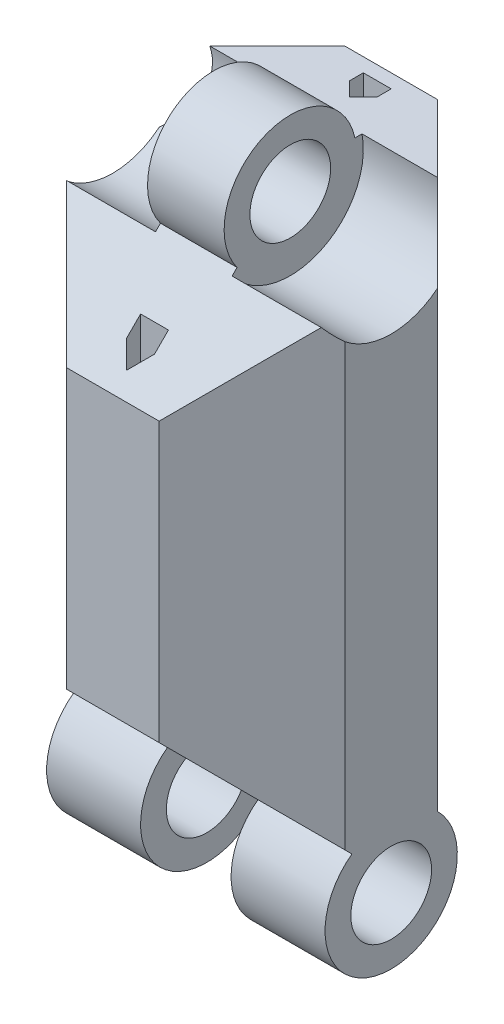
ISO-10303-21;
HEADER;
FILE_DESCRIPTION(('STEP AP214'),'2;1');
FILE_NAME('part.step','',(''),(''),'','','');
FILE_SCHEMA(('AUTOMOTIVE_DESIGN { 1 0 10303 214 1 1 1 1 }'));
ENDSEC;
DATA;
#1=APPLICATION_CONTEXT('core data for automotive mechanical design processes');
#2=APPLICATION_PROTOCOL_DEFINITION('international standard','automotive_design',2000,#1);
#3=PRODUCT_CONTEXT('',#1,'mechanical');
#4=PRODUCT('Part','Part','',(#3));
#5=PRODUCT_RELATED_PRODUCT_CATEGORY('part','',(#4));
#6=PRODUCT_DEFINITION_FORMATION('','',#4);
#7=PRODUCT_DEFINITION_CONTEXT('part definition',#1,'design');
#8=PRODUCT_DEFINITION('design','',#6,#7);
#9=PRODUCT_DEFINITION_SHAPE('','',#8);
#10=(LENGTH_UNIT() NAMED_UNIT(*) SI_UNIT(.MILLI.,.METRE.));
#11=(NAMED_UNIT(*) PLANE_ANGLE_UNIT() SI_UNIT($,.RADIAN.));
#12=(NAMED_UNIT(*) SI_UNIT($,.STERADIAN.) SOLID_ANGLE_UNIT());
#13=UNCERTAINTY_MEASURE_WITH_UNIT(LENGTH_MEASURE(1.E-05),#10,'distance_accuracy_value','');
#14=(GEOMETRIC_REPRESENTATION_CONTEXT(3) GLOBAL_UNCERTAINTY_ASSIGNED_CONTEXT((#13)) GLOBAL_UNIT_ASSIGNED_CONTEXT((#10,
#11,#12)) REPRESENTATION_CONTEXT('',''));
#15=CARTESIAN_POINT('',(0.,0.,0.));
#16=DIRECTION('',(0.,0.,1.));
#17=DIRECTION('',(1.,0.,0.));
#18=AXIS2_PLACEMENT_3D('',#15,#16,#17);
#19=CARTESIAN_POINT('',(0.,0.,0.));
#20=DIRECTION('',(0.,1.,0.));
#21=DIRECTION('',(0.,0.,1.));
#22=AXIS2_PLACEMENT_3D('',#19,#20,#21);
#23=PLANE('',#22);
#24=DIRECTION('',(0.707106781186548,0.,-0.707106781186547));
#25=VECTOR('',#24,1.);
#26=CARTESIAN_POINT('',(0.499999999999973,0.,-4.));
#27=LINE('',#26,#25);
#28=CARTESIAN_POINT('',(0.,0.,-3.5));
#29=VERTEX_POINT('',#28);
#30=CARTESIAN_POINT('',(0.499999999999973,0.,-4.));
#31=VERTEX_POINT('',#30);
#32=EDGE_CURVE('E493',#29,#31,#27,.T.);
#33=ORIENTED_EDGE('',*,*,#32,.T.);
#34=DIRECTION('',(0.,0.,-1.));
#35=VECTOR('',#34,1.);
#36=CARTESIAN_POINT('',(0.499999999999972,0.,-4.5));
#37=LINE('',#36,#35);
#38=CARTESIAN_POINT('',(0.499999999999972,0.,-4.5));
#39=VERTEX_POINT('',#38);
#40=EDGE_CURVE('E536',#31,#39,#37,.T.);
#41=ORIENTED_EDGE('',*,*,#40,.T.);
#42=DIRECTION('',(-1.,0.,0.));
#43=VECTOR('',#42,1.);
#44=CARTESIAN_POINT('',(-0.500000000000028,0.,-4.5));
#45=LINE('',#44,#43);
#46=CARTESIAN_POINT('',(-0.500000000000028,0.,-4.5));
#47=VERTEX_POINT('',#46);
#48=EDGE_CURVE('E540',#39,#47,#45,.T.);
#49=ORIENTED_EDGE('',*,*,#48,.T.);
#50=DIRECTION('',(0.,0.,1.));
#51=VECTOR('',#50,1.);
#52=CARTESIAN_POINT('',(-0.500000000000028,0.,-4.));
#53=LINE('',#52,#51);
#54=CARTESIAN_POINT('',(-0.500000000000028,0.,-4.));
#55=VERTEX_POINT('',#54);
#56=EDGE_CURVE('E544',#47,#55,#53,.T.);
#57=ORIENTED_EDGE('',*,*,#56,.T.);
#58=DIRECTION('',(0.707106781186548,0.,0.707106781186547));
#59=VECTOR('',#58,1.);
#60=CARTESIAN_POINT('',(0.,0.,-3.5));
#61=LINE('',#60,#59);
#62=EDGE_CURVE('E519',#55,#29,#61,.T.);
#63=ORIENTED_EDGE('',*,*,#62,.T.);
#64=EDGE_LOOP('',(#33,#41,#49,#57,#63));
#65=FACE_BOUND('',#64,.T.);
#66=DIRECTION('',(-0.707106781186548,0.,-0.707106781186547));
#67=VECTOR('',#66,1.);
#68=CARTESIAN_POINT('',(5.,0.,-1.66666666666666));
#69=LINE('',#68,#67);
#70=CARTESIAN_POINT('',(4.34489471404082,0.,-2.32177195262584));
#71=VERTEX_POINT('',#70);
#72=CARTESIAN_POINT('',(1.66666666666666,0.,-5.));
#73=VERTEX_POINT('',#72);
#74=EDGE_CURVE('E293',#71,#73,#69,.T.);
#75=ORIENTED_EDGE('',*,*,#74,.F.);
#76=DIRECTION('',(-1.,0.,0.));
#77=VECTOR('',#76,1.);
#78=CARTESIAN_POINT('',(11.7175144212722,0.,-2.32177195262584));
#79=LINE('',#78,#77);
#80=CARTESIAN_POINT('',(1.625,0.,-2.32177195262584));
#81=VERTEX_POINT('',#80);
#82=EDGE_CURVE('E402',#71,#81,#79,.T.);
#83=ORIENTED_EDGE('',*,*,#82,.T.);
#84=DIRECTION('',(0.,0.,-1.));
#85=VECTOR('',#84,1.);
#86=CARTESIAN_POINT('',(1.625,0.,0.));
#87=LINE('',#86,#85);
#88=CARTESIAN_POINT('',(1.625,0.,-2.57694101601104));
#89=VERTEX_POINT('',#88);
#90=EDGE_CURVE('E420',#81,#89,#87,.T.);
#91=ORIENTED_EDGE('',*,*,#90,.T.);
#92=DIRECTION('',(1.,0.,0.));
#93=VECTOR('',#92,1.);
#94=CARTESIAN_POINT('',(-1.625,0.,-2.57694101601104));
#95=LINE('',#94,#93);
#96=CARTESIAN_POINT('',(-1.625,0.,-2.57694101601104));
#97=VERTEX_POINT('',#96);
#98=EDGE_CURVE('E429',#89,#97,#95,.F.);
#99=ORIENTED_EDGE('',*,*,#98,.T.);
#100=DIRECTION('',(0.,0.,-1.));
#101=VECTOR('',#100,1.);
#102=CARTESIAN_POINT('',(-1.625,0.,0.));
#103=LINE('',#102,#101);
#104=CARTESIAN_POINT('',(-1.625,0.,-2.32177195262584));
#105=VERTEX_POINT('',#104);
#106=EDGE_CURVE('E426',#105,#97,#103,.T.);
#107=ORIENTED_EDGE('',*,*,#106,.F.);
#108=DIRECTION('',(1.,0.,0.));
#109=VECTOR('',#108,1.);
#110=CARTESIAN_POINT('',(-11.7175144212722,0.,-2.32177195262584));
#111=LINE('',#110,#109);
#112=CARTESIAN_POINT('',(-4.34489471404082,0.,-2.32177195262584));
#113=VERTEX_POINT('',#112);
#114=EDGE_CURVE('E248',#105,#113,#111,.F.);
#115=ORIENTED_EDGE('',*,*,#114,.T.);
#116=DIRECTION('',(-0.707106781186547,0.,0.707106781186548));
#117=VECTOR('',#116,1.);
#118=CARTESIAN_POINT('',(-1.66666666666666,0.,-5.));
#119=LINE('',#118,#117);
#120=CARTESIAN_POINT('',(-1.66666666666666,0.,-5.));
#121=VERTEX_POINT('',#120);
#122=EDGE_CURVE('E298',#121,#113,#119,.T.);
#123=ORIENTED_EDGE('',*,*,#122,.F.);
#124=DIRECTION('',(-1.,0.,0.));
#125=VECTOR('',#124,1.);
#126=CARTESIAN_POINT('',(1.66666666666666,0.,-5.));
#127=LINE('',#126,#125);
#128=EDGE_CURVE('E308',#73,#121,#127,.T.);
#129=ORIENTED_EDGE('',*,*,#128,.F.);
#130=EDGE_LOOP('',(#75,#83,#91,#99,#107,#115,#123,#129));
#131=FACE_BOUND('',#130,.T.);
#132=ADVANCED_FACE('F39',(#65,#131),#23,.F.);
#133=CARTESIAN_POINT('',(-5.,4.99999999999995,5.));
#134=DIRECTION('',(0.,-0.707106781186551,0.707106781186543));
#135=DIRECTION('',(0.,-0.707106781186544,-0.707106781186552));
#136=AXIS2_PLACEMENT_3D('',#133,#134,#135);
#137=PLANE('',#136);
#138=DIRECTION('',(-1.,0.,0.));
#139=VECTOR('',#138,1.);
#140=CARTESIAN_POINT('',(11.7175144212722,1.4106662819483,1.41066628194831));
#141=LINE('',#140,#139);
#142=CARTESIAN_POINT('',(5.,1.4106662819483,1.41066628194831));
#143=VERTEX_POINT('',#142);
#144=CARTESIAN_POINT('',(1.625,1.4106662819483,1.41066628194831));
#145=VERTEX_POINT('',#144);
#146=EDGE_CURVE('E405',#143,#145,#141,.T.);
#147=ORIENTED_EDGE('',*,*,#146,.F.);
#148=DIRECTION('',(0.,-0.707106781186544,-0.707106781186552));
#149=VECTOR('',#148,1.);
#150=CARTESIAN_POINT('',(5.,4.99999999999995,5.));
#151=LINE('',#150,#149);
#152=CARTESIAN_POINT('',(5.,1.66666666666664,1.66666666666666));
#153=VERTEX_POINT('',#152);
#154=EDGE_CURVE('E268',#153,#143,#151,.T.);
#155=ORIENTED_EDGE('',*,*,#154,.F.);
#156=DIRECTION('',(-0.577350269189627,0.577350269189622,0.577350269189628));
#157=VECTOR('',#156,1.);
#158=CARTESIAN_POINT('',(-3.33333333333333,9.9999999999999,10.));
#159=LINE('',#158,#157);
#160=CARTESIAN_POINT('',(1.66666666666666,4.99999999999995,5.));
#161=VERTEX_POINT('',#160);
#162=EDGE_CURVE('E281',#153,#161,#159,.T.);
#163=ORIENTED_EDGE('',*,*,#162,.T.);
#164=DIRECTION('',(1.,0.,0.));
#165=VECTOR('',#164,1.);
#166=CARTESIAN_POINT('',(-5.,4.99999999999995,5.));
#167=LINE('',#166,#165);
#168=CARTESIAN_POINT('',(-1.66666666666666,4.99999999999995,5.));
#169=VERTEX_POINT('',#168);
#170=EDGE_CURVE('E269',#169,#161,#167,.T.);
#171=ORIENTED_EDGE('',*,*,#170,.F.);
#172=DIRECTION('',(-0.577350269189627,-0.577350269189622,-0.577350269189629));
#173=VECTOR('',#172,1.);
#174=CARTESIAN_POINT('',(1.11111111111109,7.77777777777768,7.77777777777777));
#175=LINE('',#174,#173);
#176=CARTESIAN_POINT('',(-5.,1.66666666666664,1.66666666666666));
#177=VERTEX_POINT('',#176);
#178=EDGE_CURVE('E266',#169,#177,#175,.T.);
#179=ORIENTED_EDGE('',*,*,#178,.T.);
#180=DIRECTION('',(0.,-0.707106781186544,-0.707106781186552));
#181=VECTOR('',#180,1.);
#182=CARTESIAN_POINT('',(-5.,4.99999999999995,5.));
#183=LINE('',#182,#181);
#184=CARTESIAN_POINT('',(-5.,1.4106662819483,1.41066628194831));
#185=VERTEX_POINT('',#184);
#186=EDGE_CURVE('E255',#177,#185,#183,.T.);
#187=ORIENTED_EDGE('',*,*,#186,.T.);
#188=DIRECTION('',(1.,0.,0.));
#189=VECTOR('',#188,1.);
#190=CARTESIAN_POINT('',(-11.7175144212722,1.4106662819483,1.41066628194831));
#191=LINE('',#190,#189);
#192=CARTESIAN_POINT('',(-1.625,1.4106662819483,1.41066628194831));
#193=VERTEX_POINT('',#192);
#194=EDGE_CURVE('E236',#193,#185,#191,.F.);
#195=ORIENTED_EDGE('',*,*,#194,.F.);
#196=DIRECTION('',(0.,0.707106781186544,0.707106781186552));
#197=VECTOR('',#196,1.);
#198=CARTESIAN_POINT('',(-1.625,4.99999999999995,5.));
#199=LINE('',#198,#197);
#200=CARTESIAN_POINT('',(-1.625,1.58924237119526,1.58924237119528));
#201=VERTEX_POINT('',#200);
#202=EDGE_CURVE('E11',#193,#201,#199,.T.);
#203=ORIENTED_EDGE('',*,*,#202,.T.);
#204=DIRECTION('',(1.,0.,0.));
#205=VECTOR('',#204,1.);
#206=CARTESIAN_POINT('',(-1.625,1.58924237119526,1.58924237119528));
#207=LINE('',#206,#205);
#208=CARTESIAN_POINT('',(1.625,1.58924237119526,1.58924237119528));
#209=VERTEX_POINT('',#208);
#210=EDGE_CURVE('E49',#209,#201,#207,.F.);
#211=ORIENTED_EDGE('',*,*,#210,.F.);
#212=DIRECTION('',(0.,0.707106781186544,0.707106781186552));
#213=VECTOR('',#212,1.);
#214=CARTESIAN_POINT('',(1.625,4.99999999999995,5.));
#215=LINE('',#214,#213);
#216=EDGE_CURVE('E366',#145,#209,#215,.T.);
#217=ORIENTED_EDGE('',*,*,#216,.F.);
#218=EDGE_LOOP('',(#147,#155,#163,#171,#179,#187,#195,#203,#211,#217));
#219=FACE_BOUND('',#218,.T.);
#220=DIRECTION('',(0.577350269189628,0.577350269189621,0.577350269189628));
#221=VECTOR('',#220,1.);
#222=CARTESIAN_POINT('',(-1.33333333333335,3.16666666666662,3.16666666666666));
#223=LINE('',#222,#221);
#224=CARTESIAN_POINT('',(-0.500000000000001,3.99999999999996,4.));
#225=VERTEX_POINT('',#224);
#226=CARTESIAN_POINT('',(0.,4.49999999999995,4.5));
#227=VERTEX_POINT('',#226);
#228=EDGE_CURVE('E514',#225,#227,#223,.T.);
#229=ORIENTED_EDGE('',*,*,#228,.T.);
#230=DIRECTION('',(0.577350269189628,-0.577350269189621,-0.577350269189628));
#231=VECTOR('',#230,1.);
#232=CARTESIAN_POINT('',(-2.00000000000001,6.49999999999994,6.50000000000002));
#233=LINE('',#232,#231);
#234=CARTESIAN_POINT('',(0.500000000000001,3.99999999999996,4.));
#235=VERTEX_POINT('',#234);
#236=EDGE_CURVE('E277',#227,#235,#233,.T.);
#237=ORIENTED_EDGE('',*,*,#236,.T.);
#238=DIRECTION('',(0.,-0.707106781186544,-0.707106781186552));
#239=VECTOR('',#238,1.);
#240=CARTESIAN_POINT('',(0.500000000000005,4.99999999999994,5.));
#241=LINE('',#240,#239);
#242=CARTESIAN_POINT('',(0.499999999999999,3.49999999999996,3.5));
#243=VERTEX_POINT('',#242);
#244=EDGE_CURVE('E577',#235,#243,#241,.T.);
#245=ORIENTED_EDGE('',*,*,#244,.T.);
#246=DIRECTION('',(-1.,0.,0.));
#247=VECTOR('',#246,1.);
#248=CARTESIAN_POINT('',(-5.,3.49999999999996,3.5));
#249=LINE('',#248,#247);
#250=CARTESIAN_POINT('',(-0.500000000000001,3.49999999999997,3.50000000000001));
#251=VERTEX_POINT('',#250);
#252=EDGE_CURVE('E573',#243,#251,#249,.T.);
#253=ORIENTED_EDGE('',*,*,#252,.T.);
#254=DIRECTION('',(0.,0.707106781186544,0.707106781186552));
#255=VECTOR('',#254,1.);
#256=CARTESIAN_POINT('',(-0.5,4.99999999999995,5.));
#257=LINE('',#256,#255);
#258=EDGE_CURVE('E569',#251,#225,#257,.T.);
#259=ORIENTED_EDGE('',*,*,#258,.T.);
#260=EDGE_LOOP('',(#229,#237,#245,#253,#259));
#261=FACE_BOUND('',#260,.T.);
#262=ADVANCED_FACE('F263',(#219,#261),#137,.T.);
#263=CARTESIAN_POINT('',(0.,20.,0.));
#264=DIRECTION('',(0.,1.,0.));
#265=DIRECTION('',(0.,0.,1.));
#266=AXIS2_PLACEMENT_3D('',#263,#264,#265);
#267=PLANE('',#266);
#268=DIRECTION('',(1.,0.,0.));
#269=VECTOR('',#268,1.);
#270=CARTESIAN_POINT('',(-5.,20.,-2.57694101601104));
#271=LINE('',#270,#269);
#272=CARTESIAN_POINT('',(-1.375,20.,-2.57694101601104));
#273=VERTEX_POINT('',#272);
#274=CARTESIAN_POINT('',(-4.08972565065562,20.,-2.57694101601104));
#275=VERTEX_POINT('',#274);
#276=EDGE_CURVE('E444',#273,#275,#271,.F.);
#277=ORIENTED_EDGE('',*,*,#276,.F.);
#278=DIRECTION('',(0.,0.,1.));
#279=VECTOR('',#278,1.);
#280=CARTESIAN_POINT('',(-1.375,20.,0.));
#281=LINE('',#280,#279);
#282=CARTESIAN_POINT('',(-1.375,20.,-2.32177195262584));
#283=VERTEX_POINT('',#282);
#284=EDGE_CURVE('E437',#273,#283,#281,.T.);
#285=ORIENTED_EDGE('',*,*,#284,.T.);
#286=DIRECTION('',(-1.,0.,0.));
#287=VECTOR('',#286,1.);
#288=CARTESIAN_POINT('',(1.375,20.,-2.32177195262584));
#289=LINE('',#288,#287);
#290=CARTESIAN_POINT('',(1.375,20.,-2.32177195262584));
#291=VERTEX_POINT('',#290);
#292=EDGE_CURVE('E486',#283,#291,#289,.F.);
#293=ORIENTED_EDGE('',*,*,#292,.T.);
#294=DIRECTION('',(0.,0.,-1.));
#295=VECTOR('',#294,1.);
#296=CARTESIAN_POINT('',(1.375,20.,0.));
#297=LINE('',#296,#295);
#298=CARTESIAN_POINT('',(1.375,20.,-2.57694101601104));
#299=VERTEX_POINT('',#298);
#300=EDGE_CURVE('E467',#291,#299,#297,.T.);
#301=ORIENTED_EDGE('',*,*,#300,.T.);
#302=DIRECTION('',(-1.,0.,0.));
#303=VECTOR('',#302,1.);
#304=CARTESIAN_POINT('',(5.,20.,-2.57694101601104));
#305=LINE('',#304,#303);
#306=CARTESIAN_POINT('',(4.08972565065563,20.,-2.57694101601104));
#307=VERTEX_POINT('',#306);
#308=EDGE_CURVE('E471',#299,#307,#305,.F.);
#309=ORIENTED_EDGE('',*,*,#308,.T.);
#310=DIRECTION('',(-0.707106781186548,0.,-0.707106781186547));
#311=VECTOR('',#310,1.);
#312=CARTESIAN_POINT('',(5.,20.,-1.66666666666666));
#313=LINE('',#312,#311);
#314=CARTESIAN_POINT('',(1.66666666666666,20.,-5.));
#315=VERTEX_POINT('',#314);
#316=EDGE_CURVE('E294',#307,#315,#313,.T.);
#317=ORIENTED_EDGE('',*,*,#316,.T.);
#318=DIRECTION('',(-1.,0.,0.));
#319=VECTOR('',#318,1.);
#320=CARTESIAN_POINT('',(1.66666666666666,20.,-5.));
#321=LINE('',#320,#319);
#322=CARTESIAN_POINT('',(-1.66666666666666,20.,-5.));
#323=VERTEX_POINT('',#322);
#324=EDGE_CURVE('E297',#315,#323,#321,.T.);
#325=ORIENTED_EDGE('',*,*,#324,.T.);
#326=DIRECTION('',(-0.707106781186547,0.,0.707106781186548));
#327=VECTOR('',#326,1.);
#328=CARTESIAN_POINT('',(-1.66666666666666,20.,-5.));
#329=LINE('',#328,#327);
#330=EDGE_CURVE('E301',#323,#275,#329,.T.);
#331=ORIENTED_EDGE('',*,*,#330,.T.);
#332=EDGE_LOOP('',(#277,#285,#293,#301,#309,#317,#325,#331));
#333=FACE_BOUND('',#332,.T.);
#334=DIRECTION('',(0.,0.,-1.));
#335=VECTOR('',#334,1.);
#336=CARTESIAN_POINT('',(0.499999999999972,20.,-4.5));
#337=LINE('',#336,#335);
#338=CARTESIAN_POINT('',(0.499999999999973,20.,-4.));
#339=VERTEX_POINT('',#338);
#340=CARTESIAN_POINT('',(0.499999999999972,20.,-4.5));
#341=VERTEX_POINT('',#340);
#342=EDGE_CURVE('E518',#339,#341,#337,.T.);
#343=ORIENTED_EDGE('',*,*,#342,.F.);
#344=DIRECTION('',(0.707106781186548,0.,-0.707106781186547));
#345=VECTOR('',#344,1.);
#346=CARTESIAN_POINT('',(0.499999999999973,20.,-4.));
#347=LINE('',#346,#345);
#348=CARTESIAN_POINT('',(0.,20.,-3.5));
#349=VERTEX_POINT('',#348);
#350=EDGE_CURVE('E515',#349,#339,#347,.T.);
#351=ORIENTED_EDGE('',*,*,#350,.F.);
#352=DIRECTION('',(0.707106781186548,0.,0.707106781186547));
#353=VECTOR('',#352,1.);
#354=CARTESIAN_POINT('',(0.,20.,-3.5));
#355=LINE('',#354,#353);
#356=CARTESIAN_POINT('',(-0.500000000000028,20.,-4.));
#357=VERTEX_POINT('',#356);
#358=EDGE_CURVE('E529',#357,#349,#355,.T.);
#359=ORIENTED_EDGE('',*,*,#358,.F.);
#360=DIRECTION('',(0.,0.,1.));
#361=VECTOR('',#360,1.);
#362=CARTESIAN_POINT('',(-0.500000000000028,20.,-4.));
#363=LINE('',#362,#361);
#364=CARTESIAN_POINT('',(-0.500000000000028,20.,-4.5));
#365=VERTEX_POINT('',#364);
#366=EDGE_CURVE('E525',#365,#357,#363,.T.);
#367=ORIENTED_EDGE('',*,*,#366,.F.);
#368=DIRECTION('',(-1.,0.,0.));
#369=VECTOR('',#368,1.);
#370=CARTESIAN_POINT('',(-0.500000000000028,20.,-4.5));
#371=LINE('',#370,#369);
#372=EDGE_CURVE('E522',#341,#365,#371,.T.);
#373=ORIENTED_EDGE('',*,*,#372,.F.);
#374=EDGE_LOOP('',(#343,#351,#359,#367,#373));
#375=FACE_BOUND('',#374,.T.);
#376=ADVANCED_FACE('F639',(#333,#375),#267,.T.);
#377=CARTESIAN_POINT('',(-5.,15.,5.));
#378=DIRECTION('',(0.,-0.707106781186551,-0.707106781186544));
#379=DIRECTION('',(0.,0.707106781186544,-0.707106781186551));
#380=AXIS2_PLACEMENT_3D('',#377,#378,#379);
#381=PLANE('',#380);
#382=DIRECTION('',(0.577350269189628,0.577350269189622,-0.577350269189628));
#383=VECTOR('',#382,1.);
#384=CARTESIAN_POINT('',(-2.00000000000001,13.5000000000001,6.50000000000001));
#385=LINE('',#384,#383);
#386=CARTESIAN_POINT('',(0.,15.5,4.5));
#387=VERTEX_POINT('',#386);
#388=CARTESIAN_POINT('',(0.500000000000001,16.,4.));
#389=VERTEX_POINT('',#388);
#390=EDGE_CURVE('E352',#387,#389,#385,.T.);
#391=ORIENTED_EDGE('',*,*,#390,.F.);
#392=DIRECTION('',(0.577350269189628,-0.577350269189622,0.577350269189628));
#393=VECTOR('',#392,1.);
#394=CARTESIAN_POINT('',(-1.33333333333335,16.8333333333334,3.16666666666666));
#395=LINE('',#394,#393);
#396=CARTESIAN_POINT('',(-0.500000000000001,16.,4.));
#397=VERTEX_POINT('',#396);
#398=EDGE_CURVE('E339',#397,#387,#395,.T.);
#399=ORIENTED_EDGE('',*,*,#398,.F.);
#400=DIRECTION('',(0.,-0.707106781186544,0.707106781186551));
#401=VECTOR('',#400,1.);
#402=CARTESIAN_POINT('',(-0.5,15.,5.));
#403=LINE('',#402,#401);
#404=CARTESIAN_POINT('',(-0.500000000000001,16.5,3.5));
#405=VERTEX_POINT('',#404);
#406=EDGE_CURVE('E342',#405,#397,#403,.T.);
#407=ORIENTED_EDGE('',*,*,#406,.F.);
#408=DIRECTION('',(-1.,0.,0.));
#409=VECTOR('',#408,1.);
#410=CARTESIAN_POINT('',(-5.,16.5,3.5));
#411=LINE('',#410,#409);
#412=CARTESIAN_POINT('',(0.499999999999999,16.5,3.5));
#413=VERTEX_POINT('',#412);
#414=EDGE_CURVE('E346',#413,#405,#411,.T.);
#415=ORIENTED_EDGE('',*,*,#414,.F.);
#416=DIRECTION('',(0.,0.707106781186544,-0.707106781186551));
#417=VECTOR('',#416,1.);
#418=CARTESIAN_POINT('',(0.500000000000005,15.0000000000001,5.));
#419=LINE('',#418,#417);
#420=EDGE_CURVE('E349',#389,#413,#419,.T.);
#421=ORIENTED_EDGE('',*,*,#420,.F.);
#422=EDGE_LOOP('',(#391,#399,#407,#415,#421));
#423=FACE_BOUND('',#422,.T.);
#424=DIRECTION('',(0.,0.707106781186544,-0.707106781186551));
#425=VECTOR('',#424,1.);
#426=CARTESIAN_POINT('',(-1.375,15.,5.));
#427=LINE('',#426,#425);
#428=CARTESIAN_POINT('',(-1.375,17.9107576288047,2.08924237119528));
#429=VERTEX_POINT('',#428);
#430=CARTESIAN_POINT('',(-1.375,18.0893337180517,1.91066628194831));
#431=VERTEX_POINT('',#430);
#432=EDGE_CURVE('E441',#429,#431,#427,.T.);
#433=ORIENTED_EDGE('',*,*,#432,.F.);
#434=DIRECTION('',(1.,0.,0.));
#435=VECTOR('',#434,1.);
#436=CARTESIAN_POINT('',(-5.,17.9107576288047,2.08924237119528));
#437=LINE('',#436,#435);
#438=CARTESIAN_POINT('',(-4.57742429547138,17.9107576288047,2.08924237119528));
#439=VERTEX_POINT('',#438);
#440=EDGE_CURVE('E453',#429,#439,#437,.F.);
#441=ORIENTED_EDGE('',*,*,#440,.T.);
#442=DIRECTION('',(-0.577350269189627,0.577350269189622,-0.577350269189628));
#443=VECTOR('',#442,1.);
#444=CARTESIAN_POINT('',(-5.55555555555554,18.8888888888889,1.11111111111111));
#445=LINE('',#444,#443);
#446=CARTESIAN_POINT('',(-1.66666666666666,15.,5.));
#447=VERTEX_POINT('',#446);
#448=EDGE_CURVE('E289',#447,#439,#445,.T.);
#449=ORIENTED_EDGE('',*,*,#448,.F.);
#450=DIRECTION('',(1.,0.,0.));
#451=VECTOR('',#450,1.);
#452=CARTESIAN_POINT('',(-5.,15.,5.));
#453=LINE('',#452,#451);
#454=CARTESIAN_POINT('',(1.66666666666666,15.,5.00000000000001));
#455=VERTEX_POINT('',#454);
#456=EDGE_CURVE('E274',#447,#455,#453,.T.);
#457=ORIENTED_EDGE('',*,*,#456,.T.);
#458=DIRECTION('',(-0.577350269189627,-0.577350269189622,0.577350269189628));
#459=VECTOR('',#458,1.);
#460=CARTESIAN_POINT('',(3.33333333333331,16.6666666666667,3.33333333333336));
#461=LINE('',#460,#459);
#462=CARTESIAN_POINT('',(4.57742429547139,17.9107576288047,2.08924237119528));
#463=VERTEX_POINT('',#462);
#464=EDGE_CURVE('E286',#463,#455,#461,.T.);
#465=ORIENTED_EDGE('',*,*,#464,.F.);
#466=DIRECTION('',(-1.,0.,0.));
#467=VECTOR('',#466,1.);
#468=CARTESIAN_POINT('',(5.,17.9107576288047,2.08924237119528));
#469=LINE('',#468,#467);
#470=CARTESIAN_POINT('',(1.375,17.9107576288047,2.08924237119528));
#471=VERTEX_POINT('',#470);
#472=EDGE_CURVE('E478',#471,#463,#469,.F.);
#473=ORIENTED_EDGE('',*,*,#472,.F.);
#474=DIRECTION('',(0.,-0.707106781186544,0.707106781186551));
#475=VECTOR('',#474,1.);
#476=CARTESIAN_POINT('',(1.375,15.,5.));
#477=LINE('',#476,#475);
#478=CARTESIAN_POINT('',(1.375,18.0893337180517,1.91066628194831));
#479=VERTEX_POINT('',#478);
#480=EDGE_CURVE('E461',#479,#471,#477,.T.);
#481=ORIENTED_EDGE('',*,*,#480,.F.);
#482=DIRECTION('',(-1.,0.,0.));
#483=VECTOR('',#482,1.);
#484=CARTESIAN_POINT('',(1.375,18.0893337180517,1.91066628194831));
#485=LINE('',#484,#483);
#486=EDGE_CURVE('E355',#431,#479,#485,.F.);
#487=ORIENTED_EDGE('',*,*,#486,.F.);
#488=EDGE_LOOP('',(#433,#441,#449,#457,#465,#473,#481,#487));
#489=FACE_BOUND('',#488,.T.);
#490=ADVANCED_FACE('F590',(#423,#489),#381,.F.);
#491=CARTESIAN_POINT('',(1.66666666666666,20.,5.));
#492=DIRECTION('',(-0.707106781186548,0.,-0.707106781186547));
#493=DIRECTION('',(-0.707106781186547,0.,0.707106781186548));
#494=AXIS2_PLACEMENT_3D('',#491,#492,#493);
#495=PLANE('',#494);
#496=CARTESIAN_POINT('',(6.66666666666666,19.5,0.));
#497=DIRECTION('',(-0.707106781186548,0.,-0.707106781186547));
#498=DIRECTION('',(-0.707106781186547,0.,0.707106781186548));
#499=AXIS2_PLACEMENT_3D('',#496,#497,#498);
#500=ELLIPSE('',#499,3.71231060122937,2.625);
#501=CARTESIAN_POINT('',(5.,17.471984412727,1.66666666666666));
#502=VERTEX_POINT('',#501);
#503=EDGE_CURVE('E475',#463,#502,#500,.F.);
#504=ORIENTED_EDGE('',*,*,#503,.F.);
#505=ORIENTED_EDGE('',*,*,#464,.T.);
#506=DIRECTION('',(0.,-1.,0.));
#507=VECTOR('',#506,1.);
#508=CARTESIAN_POINT('',(1.66666666666666,20.,5.));
#509=LINE('',#508,#507);
#510=EDGE_CURVE('E331',#455,#161,#509,.T.);
#511=ORIENTED_EDGE('',*,*,#510,.T.);
#512=ORIENTED_EDGE('',*,*,#162,.F.);
#513=DIRECTION('',(0.,-1.,0.));
#514=VECTOR('',#513,1.);
#515=CARTESIAN_POINT('',(5.,20.,1.66666666666666));
#516=LINE('',#515,#514);
#517=EDGE_CURVE('E328',#502,#153,#516,.T.);
#518=ORIENTED_EDGE('',*,*,#517,.F.);
#519=EDGE_LOOP('',(#504,#505,#511,#512,#518));
#520=FACE_BOUND('',#519,.T.);
#521=ADVANCED_FACE('F598',(#520),#495,.F.);
#522=CARTESIAN_POINT('',(5.,20.,-1.66666666666666));
#523=DIRECTION('',(-0.707106781186547,0.,0.707106781186548));
#524=DIRECTION('',(0.707106781186548,0.,0.707106781186547));
#525=AXIS2_PLACEMENT_3D('',#522,#523,#524);
#526=PLANE('',#525);
#527=DIRECTION('',(0.,-1.,0.));
#528=VECTOR('',#527,1.);
#529=CARTESIAN_POINT('',(5.,20.,-1.66666666666666));
#530=LINE('',#529,#528);
#531=CARTESIAN_POINT('',(5.,17.471984412727,-1.66666666666666));
#532=VERTEX_POINT('',#531);
#533=CARTESIAN_POINT('',(5.,1.19199504202059,-1.66666666666666));
#534=VERTEX_POINT('',#533);
#535=EDGE_CURVE('E62',#532,#534,#530,.T.);
#536=ORIENTED_EDGE('',*,*,#535,.T.);
#537=CARTESIAN_POINT('',(6.66666666666667,-0.5,0.));
#538=DIRECTION('',(-0.707106781186547,0.,0.707106781186548));
#539=DIRECTION('',(-0.707106781186548,0.,-0.707106781186547));
#540=AXIS2_PLACEMENT_3D('',#537,#538,#539);
#541=ELLIPSE('',#540,3.3587572106361,2.375);
#542=EDGE_CURVE('E57',#534,#71,#541,.T.);
#543=ORIENTED_EDGE('',*,*,#542,.T.);
#544=ORIENTED_EDGE('',*,*,#74,.T.);
#545=DIRECTION('',(0.,-1.,0.));
#546=VECTOR('',#545,1.);
#547=CARTESIAN_POINT('',(1.66666666666666,20.,-5.));
#548=LINE('',#547,#546);
#549=EDGE_CURVE('E322',#315,#73,#548,.T.);
#550=ORIENTED_EDGE('',*,*,#549,.F.);
#551=ORIENTED_EDGE('',*,*,#316,.F.);
#552=CARTESIAN_POINT('',(6.66666666666667,19.5,0.));
#553=DIRECTION('',(-0.707106781186547,0.,0.707106781186548));
#554=DIRECTION('',(-0.707106781186548,0.,-0.707106781186547));
#555=AXIS2_PLACEMENT_3D('',#552,#553,#554);
#556=ELLIPSE('',#555,3.71231060122938,2.625);
#557=EDGE_CURVE('E359',#532,#307,#556,.F.);
#558=ORIENTED_EDGE('',*,*,#557,.F.);
#559=EDGE_LOOP('',(#536,#543,#544,#550,#551,#558));
#560=FACE_BOUND('',#559,.T.);
#561=ADVANCED_FACE('F636',(#560),#526,.F.);
#562=CARTESIAN_POINT('',(-5.,20.,1.66666666666666));
#563=DIRECTION('',(0.707106781186549,0.,-0.707106781186546));
#564=DIRECTION('',(-0.707106781186546,0.,-0.707106781186549));
#565=AXIS2_PLACEMENT_3D('',#562,#563,#564);
#566=PLANE('',#565);
#567=ORIENTED_EDGE('',*,*,#448,.T.);
#568=CARTESIAN_POINT('',(-6.66666666666665,19.5,0.));
#569=DIRECTION('',(0.707106781186549,0.,-0.707106781186546));
#570=DIRECTION('',(0.707106781186546,0.,0.707106781186549));
#571=AXIS2_PLACEMENT_3D('',#568,#569,#570);
#572=ELLIPSE('',#571,3.71231060122937,2.625);
#573=CARTESIAN_POINT('',(-5.,17.471984412727,1.66666666666666));
#574=VERTEX_POINT('',#573);
#575=EDGE_CURVE('E449',#439,#574,#572,.T.);
#576=ORIENTED_EDGE('',*,*,#575,.T.);
#577=DIRECTION('',(0.,-1.,0.));
#578=VECTOR('',#577,1.);
#579=CARTESIAN_POINT('',(-5.,20.,1.66666666666666));
#580=LINE('',#579,#578);
#581=EDGE_CURVE('E305',#574,#177,#580,.T.);
#582=ORIENTED_EDGE('',*,*,#581,.T.);
#583=ORIENTED_EDGE('',*,*,#178,.F.);
#584=DIRECTION('',(0.,-1.,0.));
#585=VECTOR('',#584,1.);
#586=CARTESIAN_POINT('',(-1.66666666666666,20.,5.));
#587=LINE('',#586,#585);
#588=EDGE_CURVE('E335',#447,#169,#587,.T.);
#589=ORIENTED_EDGE('',*,*,#588,.F.);
#590=EDGE_LOOP('',(#567,#576,#582,#583,#589));
#591=FACE_BOUND('',#590,.T.);
#592=ADVANCED_FACE('F41',(#591),#566,.F.);
#593=CARTESIAN_POINT('',(-1.66666666666666,20.,5.));
#594=DIRECTION('',(0.,0.,-1.));
#595=DIRECTION('',(-1.,0.,0.));
#596=AXIS2_PLACEMENT_3D('',#593,#594,#595);
#597=PLANE('',#596);
#598=ORIENTED_EDGE('',*,*,#510,.F.);
#599=ORIENTED_EDGE('',*,*,#456,.F.);
#600=ORIENTED_EDGE('',*,*,#588,.T.);
#601=ORIENTED_EDGE('',*,*,#170,.T.);
#602=EDGE_LOOP('',(#598,#599,#600,#601));
#603=FACE_BOUND('',#602,.T.);
#604=ADVANCED_FACE('F594',(#603),#597,.F.);
#605=CARTESIAN_POINT('',(5.,20.,1.66666666666666));
#606=DIRECTION('',(-1.,0.,0.));
#607=DIRECTION('',(0.,0.,1.));
#608=AXIS2_PLACEMENT_3D('',#605,#606,#607);
#609=PLANE('',#608);
#610=CARTESIAN_POINT('',(5.,-0.5,0.));
#611=DIRECTION('',(-1.,0.,0.));
#612=DIRECTION('',(0.,0.,1.));
#613=AXIS2_PLACEMENT_3D('',#610,#611,#612);
#614=CIRCLE('',#613,1.45);
#615=CARTESIAN_POINT('',(5.,-0.5,1.45));
#616=VERTEX_POINT('',#615);
#617=EDGE_CURVE('E375',#616,#616,#614,.T.);
#618=ORIENTED_EDGE('',*,*,#617,.T.);
#619=EDGE_LOOP('',(#618));
#620=FACE_BOUND('',#619,.T.);
#621=ORIENTED_EDGE('',*,*,#154,.T.);
#622=CARTESIAN_POINT('',(5.,-0.5,0.));
#623=DIRECTION('',(-1.,0.,0.));
#624=DIRECTION('',(0.,0.,1.));
#625=AXIS2_PLACEMENT_3D('',#622,#623,#624);
#626=CIRCLE('',#625,2.375);
#627=EDGE_CURVE('E396',#143,#534,#626,.F.);
#628=ORIENTED_EDGE('',*,*,#627,.T.);
#629=ORIENTED_EDGE('',*,*,#535,.F.);
#630=CARTESIAN_POINT('',(5.,19.5,0.));
#631=DIRECTION('',(1.,0.,0.));
#632=DIRECTION('',(0.,0.,-1.));
#633=AXIS2_PLACEMENT_3D('',#630,#631,#632);
#634=CIRCLE('',#633,2.625);
#635=EDGE_CURVE('E458',#502,#532,#634,.T.);
#636=ORIENTED_EDGE('',*,*,#635,.F.);
#637=ORIENTED_EDGE('',*,*,#517,.T.);
#638=EDGE_LOOP('',(#621,#628,#629,#636,#637));
#639=FACE_BOUND('',#638,.T.);
#640=ADVANCED_FACE('F605',(#620,#639),#609,.F.);
#641=CARTESIAN_POINT('',(-5.,20.,-1.66666666666666));
#642=DIRECTION('',(1.,0.,0.));
#643=DIRECTION('',(0.,0.,-1.));
#644=AXIS2_PLACEMENT_3D('',#641,#642,#643);
#645=PLANE('',#644);
#646=CARTESIAN_POINT('',(-5.,-0.5,0.));
#647=DIRECTION('',(1.,0.,0.));
#648=DIRECTION('',(0.,0.,-1.));
#649=AXIS2_PLACEMENT_3D('',#646,#647,#648);
#650=CIRCLE('',#649,1.45);
#651=CARTESIAN_POINT('',(-5.,-0.5,-1.45));
#652=VERTEX_POINT('',#651);
#653=EDGE_CURVE('E875',#652,#652,#650,.T.);
#654=ORIENTED_EDGE('',*,*,#653,.T.);
#655=EDGE_LOOP('',(#654));
#656=FACE_BOUND('',#655,.T.);
#657=CARTESIAN_POINT('',(-5.,-0.5,0.));
#658=DIRECTION('',(1.,0.,0.));
#659=DIRECTION('',(0.,0.,-1.));
#660=AXIS2_PLACEMENT_3D('',#657,#658,#659);
#661=CIRCLE('',#660,2.375);
#662=CARTESIAN_POINT('',(-5.,1.19199504202058,-1.66666666666666));
#663=VERTEX_POINT('',#662);
#664=EDGE_CURVE('E239',#663,#185,#661,.F.);
#665=ORIENTED_EDGE('',*,*,#664,.T.);
#666=ORIENTED_EDGE('',*,*,#186,.F.);
#667=ORIENTED_EDGE('',*,*,#581,.F.);
#668=CARTESIAN_POINT('',(-5.,19.5,0.));
#669=DIRECTION('',(1.,0.,0.));
#670=DIRECTION('',(0.,0.,-1.));
#671=AXIS2_PLACEMENT_3D('',#668,#669,#670);
#672=CIRCLE('',#671,2.625);
#673=CARTESIAN_POINT('',(-5.,17.471984412727,-1.66666666666666));
#674=VERTEX_POINT('',#673);
#675=EDGE_CURVE('E434',#574,#674,#672,.T.);
#676=ORIENTED_EDGE('',*,*,#675,.T.);
#677=DIRECTION('',(0.,-1.,0.));
#678=VECTOR('',#677,1.);
#679=CARTESIAN_POINT('',(-5.,20.,-1.66666666666666));
#680=LINE('',#679,#678);
#681=EDGE_CURVE('E258',#674,#663,#680,.T.);
#682=ORIENTED_EDGE('',*,*,#681,.T.);
#683=EDGE_LOOP('',(#665,#666,#667,#676,#682));
#684=FACE_BOUND('',#683,.T.);
#685=ADVANCED_FACE('F253',(#656,#684),#645,.F.);
#686=CARTESIAN_POINT('',(1.66666666666666,20.,-5.));
#687=DIRECTION('',(0.,0.,1.));
#688=DIRECTION('',(1.,0.,0.));
#689=AXIS2_PLACEMENT_3D('',#686,#687,#688);
#690=PLANE('',#689);
#691=ORIENTED_EDGE('',*,*,#128,.T.);
#692=DIRECTION('',(0.,-1.,0.));
#693=VECTOR('',#692,1.);
#694=CARTESIAN_POINT('',(-1.66666666666666,20.,-5.));
#695=LINE('',#694,#693);
#696=EDGE_CURVE('E318',#323,#121,#695,.T.);
#697=ORIENTED_EDGE('',*,*,#696,.F.);
#698=ORIENTED_EDGE('',*,*,#324,.F.);
#699=ORIENTED_EDGE('',*,*,#549,.T.);
#700=EDGE_LOOP('',(#691,#697,#698,#699));
#701=FACE_BOUND('',#700,.T.);
#702=ADVANCED_FACE('F633',(#701),#690,.F.);
#703=CARTESIAN_POINT('',(-1.66666666666666,20.,-5.));
#704=DIRECTION('',(0.707106781186548,0.,0.707106781186547));
#705=DIRECTION('',(0.707106781186547,0.,-0.707106781186548));
#706=AXIS2_PLACEMENT_3D('',#703,#704,#705);
#707=PLANE('',#706);
#708=ORIENTED_EDGE('',*,*,#122,.T.);
#709=CARTESIAN_POINT('',(-6.66666666666666,-0.5,0.));
#710=DIRECTION('',(0.707106781186548,0.,0.707106781186547));
#711=DIRECTION('',(0.707106781186547,0.,-0.707106781186548));
#712=AXIS2_PLACEMENT_3D('',#709,#710,#711);
#713=ELLIPSE('',#712,3.3587572106361,2.375);
#714=EDGE_CURVE('E260',#113,#663,#713,.T.);
#715=ORIENTED_EDGE('',*,*,#714,.T.);
#716=ORIENTED_EDGE('',*,*,#681,.F.);
#717=CARTESIAN_POINT('',(-6.66666666666666,19.5,0.));
#718=DIRECTION('',(0.707106781186548,0.,0.707106781186547));
#719=DIRECTION('',(0.707106781186547,0.,-0.707106781186548));
#720=AXIS2_PLACEMENT_3D('',#717,#718,#719);
#721=ELLIPSE('',#720,3.71231060122937,2.625);
#722=EDGE_CURVE('E362',#674,#275,#721,.T.);
#723=ORIENTED_EDGE('',*,*,#722,.T.);
#724=ORIENTED_EDGE('',*,*,#330,.F.);
#725=ORIENTED_EDGE('',*,*,#696,.T.);
#726=EDGE_LOOP('',(#708,#715,#716,#723,#724,#725));
#727=FACE_BOUND('',#726,.T.);
#728=ADVANCED_FACE('F628',(#727),#707,.F.);
#729=CARTESIAN_POINT('',(0.500000000000001,20.,4.));
#730=DIRECTION('',(-0.707106781186547,0.,-0.707106781186548));
#731=DIRECTION('',(-0.707106781186548,0.,0.707106781186547));
#732=AXIS2_PLACEMENT_3D('',#729,#730,#731);
#733=PLANE('',#732);
#734=DIRECTION('',(0.,-1.,0.));
#735=VECTOR('',#734,1.);
#736=CARTESIAN_POINT('',(0.,20.,4.5));
#737=LINE('',#736,#735);
#738=EDGE_CURVE('E494',#387,#227,#737,.T.);
#739=ORIENTED_EDGE('',*,*,#738,.F.);
#740=ORIENTED_EDGE('',*,*,#390,.T.);
#741=DIRECTION('',(0.,-1.,0.));
#742=VECTOR('',#741,1.);
#743=CARTESIAN_POINT('',(0.500000000000001,20.,4.));
#744=LINE('',#743,#742);
#745=EDGE_CURVE('E510',#389,#235,#744,.T.);
#746=ORIENTED_EDGE('',*,*,#745,.T.);
#747=ORIENTED_EDGE('',*,*,#236,.F.);
#748=EDGE_LOOP('',(#739,#740,#746,#747));
#749=FACE_BOUND('',#748,.T.);
#750=ADVANCED_FACE('F677',(#749),#733,.T.);
#751=CARTESIAN_POINT('',(0.499999999999999,20.,3.5));
#752=DIRECTION('',(-1.,0.,0.));
#753=DIRECTION('',(0.,0.,1.));
#754=AXIS2_PLACEMENT_3D('',#751,#752,#753);
#755=PLANE('',#754);
#756=ORIENTED_EDGE('',*,*,#745,.F.);
#757=ORIENTED_EDGE('',*,*,#420,.T.);
#758=DIRECTION('',(0.,-1.,0.));
#759=VECTOR('',#758,1.);
#760=CARTESIAN_POINT('',(0.499999999999999,20.,3.5));
#761=LINE('',#760,#759);
#762=EDGE_CURVE('E506',#413,#243,#761,.T.);
#763=ORIENTED_EDGE('',*,*,#762,.T.);
#764=ORIENTED_EDGE('',*,*,#244,.F.);
#765=EDGE_LOOP('',(#756,#757,#763,#764));
#766=FACE_BOUND('',#765,.T.);
#767=ADVANCED_FACE('F898',(#766),#755,.T.);
#768=CARTESIAN_POINT('',(-0.500000000000001,20.,3.5));
#769=DIRECTION('',(0.,0.,1.));
#770=DIRECTION('',(1.,0.,0.));
#771=AXIS2_PLACEMENT_3D('',#768,#769,#770);
#772=PLANE('',#771);
#773=ORIENTED_EDGE('',*,*,#762,.F.);
#774=ORIENTED_EDGE('',*,*,#414,.T.);
#775=DIRECTION('',(0.,-1.,0.));
#776=VECTOR('',#775,1.);
#777=CARTESIAN_POINT('',(-0.500000000000001,20.,3.5));
#778=LINE('',#777,#776);
#779=EDGE_CURVE('E502',#405,#251,#778,.T.);
#780=ORIENTED_EDGE('',*,*,#779,.T.);
#781=ORIENTED_EDGE('',*,*,#252,.F.);
#782=EDGE_LOOP('',(#773,#774,#780,#781));
#783=FACE_BOUND('',#782,.T.);
#784=ADVANCED_FACE('F908',(#783),#772,.T.);
#785=CARTESIAN_POINT('',(-0.500000000000001,20.,4.));
#786=DIRECTION('',(1.,0.,0.));
#787=DIRECTION('',(0.,0.,-1.));
#788=AXIS2_PLACEMENT_3D('',#785,#786,#787);
#789=PLANE('',#788);
#790=ORIENTED_EDGE('',*,*,#779,.F.);
#791=ORIENTED_EDGE('',*,*,#406,.T.);
#792=DIRECTION('',(0.,-1.,0.));
#793=VECTOR('',#792,1.);
#794=CARTESIAN_POINT('',(-0.500000000000001,20.,4.));
#795=LINE('',#794,#793);
#796=EDGE_CURVE('E497',#397,#225,#795,.T.);
#797=ORIENTED_EDGE('',*,*,#796,.T.);
#798=ORIENTED_EDGE('',*,*,#258,.F.);
#799=EDGE_LOOP('',(#790,#791,#797,#798));
#800=FACE_BOUND('',#799,.T.);
#801=ADVANCED_FACE('F918',(#800),#789,.T.);
#802=CARTESIAN_POINT('',(0.,20.,4.5));
#803=DIRECTION('',(0.707106781186547,0.,-0.707106781186548));
#804=DIRECTION('',(-0.707106781186548,0.,-0.707106781186547));
#805=AXIS2_PLACEMENT_3D('',#802,#803,#804);
#806=PLANE('',#805);
#807=ORIENTED_EDGE('',*,*,#796,.F.);
#808=ORIENTED_EDGE('',*,*,#398,.T.);
#809=ORIENTED_EDGE('',*,*,#738,.T.);
#810=ORIENTED_EDGE('',*,*,#228,.F.);
#811=EDGE_LOOP('',(#807,#808,#809,#810));
#812=FACE_BOUND('',#811,.T.);
#813=ADVANCED_FACE('F928',(#812),#806,.T.);
#814=CARTESIAN_POINT('',(0.499999999999973,20.,-4.));
#815=DIRECTION('',(-0.707106781186547,0.,-0.707106781186548));
#816=DIRECTION('',(-0.707106781186548,0.,0.707106781186547));
#817=AXIS2_PLACEMENT_3D('',#814,#815,#816);
#818=PLANE('',#817);
#819=ORIENTED_EDGE('',*,*,#32,.F.);
#820=DIRECTION('',(0.,-1.,0.));
#821=VECTOR('',#820,1.);
#822=CARTESIAN_POINT('',(0.,20.,-3.5));
#823=LINE('',#822,#821);
#824=EDGE_CURVE('E532',#349,#29,#823,.T.);
#825=ORIENTED_EDGE('',*,*,#824,.F.);
#826=ORIENTED_EDGE('',*,*,#350,.T.);
#827=DIRECTION('',(0.,-1.,0.));
#828=VECTOR('',#827,1.);
#829=CARTESIAN_POINT('',(0.499999999999973,20.,-4.));
#830=LINE('',#829,#828);
#831=EDGE_CURVE('E498',#339,#31,#830,.T.);
#832=ORIENTED_EDGE('',*,*,#831,.T.);
#833=EDGE_LOOP('',(#819,#825,#826,#832));
#834=FACE_BOUND('',#833,.T.);
#835=ADVANCED_FACE('F938',(#834),#818,.T.);
#836=CARTESIAN_POINT('',(0.499999999999972,20.,-4.5));
#837=DIRECTION('',(-1.,0.,0.));
#838=DIRECTION('',(0.,0.,1.));
#839=AXIS2_PLACEMENT_3D('',#836,#837,#838);
#840=PLANE('',#839);
#841=ORIENTED_EDGE('',*,*,#40,.F.);
#842=ORIENTED_EDGE('',*,*,#831,.F.);
#843=ORIENTED_EDGE('',*,*,#342,.T.);
#844=DIRECTION('',(0.,-1.,0.));
#845=VECTOR('',#844,1.);
#846=CARTESIAN_POINT('',(0.499999999999972,20.,-4.5));
#847=LINE('',#846,#845);
#848=EDGE_CURVE('E560',#341,#39,#847,.T.);
#849=ORIENTED_EDGE('',*,*,#848,.T.);
#850=EDGE_LOOP('',(#841,#842,#843,#849));
#851=FACE_BOUND('',#850,.T.);
#852=ADVANCED_FACE('F948',(#851),#840,.T.);
#853=CARTESIAN_POINT('',(-0.500000000000028,20.,-4.5));
#854=DIRECTION('',(0.,0.,1.));
#855=DIRECTION('',(1.,0.,0.));
#856=AXIS2_PLACEMENT_3D('',#853,#854,#855);
#857=PLANE('',#856);
#858=ORIENTED_EDGE('',*,*,#48,.F.);
#859=ORIENTED_EDGE('',*,*,#848,.F.);
#860=ORIENTED_EDGE('',*,*,#372,.T.);
#861=DIRECTION('',(0.,-1.,0.));
#862=VECTOR('',#861,1.);
#863=CARTESIAN_POINT('',(-0.500000000000028,20.,-4.5));
#864=LINE('',#863,#862);
#865=EDGE_CURVE('E557',#365,#47,#864,.T.);
#866=ORIENTED_EDGE('',*,*,#865,.T.);
#867=EDGE_LOOP('',(#858,#859,#860,#866));
#868=FACE_BOUND('',#867,.T.);
#869=ADVANCED_FACE('F958',(#868),#857,.T.);
#870=CARTESIAN_POINT('',(-0.500000000000028,20.,-4.));
#871=DIRECTION('',(1.,0.,0.));
#872=DIRECTION('',(0.,0.,-1.));
#873=AXIS2_PLACEMENT_3D('',#870,#871,#872);
#874=PLANE('',#873);
#875=ORIENTED_EDGE('',*,*,#56,.F.);
#876=ORIENTED_EDGE('',*,*,#865,.F.);
#877=ORIENTED_EDGE('',*,*,#366,.T.);
#878=DIRECTION('',(0.,-1.,0.));
#879=VECTOR('',#878,1.);
#880=CARTESIAN_POINT('',(-0.500000000000028,20.,-4.));
#881=LINE('',#880,#879);
#882=EDGE_CURVE('E554',#357,#55,#881,.T.);
#883=ORIENTED_EDGE('',*,*,#882,.T.);
#884=EDGE_LOOP('',(#875,#876,#877,#883));
#885=FACE_BOUND('',#884,.T.);
#886=ADVANCED_FACE('F968',(#885),#874,.T.);
#887=CARTESIAN_POINT('',(0.,20.,-3.5));
#888=DIRECTION('',(0.707106781186547,0.,-0.707106781186548));
#889=DIRECTION('',(-0.707106781186548,0.,-0.707106781186547));
#890=AXIS2_PLACEMENT_3D('',#887,#888,#889);
#891=PLANE('',#890);
#892=ORIENTED_EDGE('',*,*,#62,.F.);
#893=ORIENTED_EDGE('',*,*,#882,.F.);
#894=ORIENTED_EDGE('',*,*,#358,.T.);
#895=ORIENTED_EDGE('',*,*,#824,.T.);
#896=EDGE_LOOP('',(#892,#893,#894,#895));
#897=FACE_BOUND('',#896,.T.);
#898=ADVANCED_FACE('F764',(#897),#891,.T.);
#899=CARTESIAN_POINT('',(1.375,19.5,0.));
#900=DIRECTION('',(-1.,0.,0.));
#901=DIRECTION('',(0.,0.,1.));
#902=AXIS2_PLACEMENT_3D('',#899,#900,#901);
#903=CYLINDRICAL_SURFACE('',#902,2.375);
#904=ORIENTED_EDGE('',*,*,#292,.F.);
#905=CARTESIAN_POINT('',(-1.375,19.5,0.));
#906=DIRECTION('',(1.,0.,0.));
#907=DIRECTION('',(0.,0.,-1.));
#908=AXIS2_PLACEMENT_3D('',#905,#906,#907);
#909=CIRCLE('',#908,2.375);
#910=EDGE_CURVE('E481',#283,#431,#909,.T.);
#911=ORIENTED_EDGE('',*,*,#910,.T.);
#912=ORIENTED_EDGE('',*,*,#486,.T.);
#913=CARTESIAN_POINT('',(1.375,19.5,0.));
#914=DIRECTION('',(1.,0.,0.));
#915=DIRECTION('',(0.,0.,-1.));
#916=AXIS2_PLACEMENT_3D('',#913,#914,#915);
#917=CIRCLE('',#916,2.375);
#918=EDGE_CURVE('E482',#291,#479,#917,.T.);
#919=ORIENTED_EDGE('',*,*,#918,.F.);
#920=EDGE_LOOP('',(#904,#911,#912,#919));
#921=FACE_BOUND('',#920,.T.);
#922=ADVANCED_FACE('F647',(#921),#903,.T.);
#923=CARTESIAN_POINT('',(1.375,19.5,0.));
#924=DIRECTION('',(1.,0.,0.));
#925=DIRECTION('',(0.,0.,-1.));
#926=AXIS2_PLACEMENT_3D('',#923,#924,#925);
#927=PLANE('',#926);
#928=CARTESIAN_POINT('',(1.375,19.5,0.));
#929=DIRECTION('',(1.,0.,0.));
#930=DIRECTION('',(0.,0.,-1.));
#931=AXIS2_PLACEMENT_3D('',#928,#929,#930);
#932=CIRCLE('',#931,1.45);
#933=CARTESIAN_POINT('',(1.375,19.5,-1.45));
#934=VERTEX_POINT('',#933);
#935=EDGE_CURVE('E374',#934,#934,#932,.T.);
#936=ORIENTED_EDGE('',*,*,#935,.F.);
#937=EDGE_LOOP('',(#936));
#938=FACE_BOUND('',#937,.T.);
#939=ORIENTED_EDGE('',*,*,#300,.F.);
#940=ORIENTED_EDGE('',*,*,#918,.T.);
#941=ORIENTED_EDGE('',*,*,#480,.T.);
#942=CARTESIAN_POINT('',(1.375,19.5,0.));
#943=DIRECTION('',(1.,0.,0.));
#944=DIRECTION('',(0.,0.,-1.));
#945=AXIS2_PLACEMENT_3D('',#942,#943,#944);
#946=CIRCLE('',#945,2.625);
#947=EDGE_CURVE('E457',#471,#299,#946,.T.);
#948=ORIENTED_EDGE('',*,*,#947,.T.);
#949=EDGE_LOOP('',(#939,#940,#941,#948));
#950=FACE_BOUND('',#949,.T.);
#951=ADVANCED_FACE('F642',(#938,#950),#927,.T.);
#952=CARTESIAN_POINT('',(-1.375,19.5,0.));
#953=DIRECTION('',(1.,0.,0.));
#954=DIRECTION('',(0.,0.,-1.));
#955=AXIS2_PLACEMENT_3D('',#952,#953,#954);
#956=PLANE('',#955);
#957=CARTESIAN_POINT('',(-1.375,19.5,0.));
#958=DIRECTION('',(1.,0.,0.));
#959=DIRECTION('',(0.,0.,-1.));
#960=AXIS2_PLACEMENT_3D('',#957,#958,#959);
#961=CIRCLE('',#960,1.45);
#962=CARTESIAN_POINT('',(-1.375,19.5,-1.45));
#963=VERTEX_POINT('',#962);
#964=EDGE_CURVE('E371',#963,#963,#961,.T.);
#965=ORIENTED_EDGE('',*,*,#964,.T.);
#966=EDGE_LOOP('',(#965));
#967=FACE_BOUND('',#966,.T.);
#968=ORIENTED_EDGE('',*,*,#910,.F.);
#969=ORIENTED_EDGE('',*,*,#284,.F.);
#970=CARTESIAN_POINT('',(-1.375,19.5,0.));
#971=DIRECTION('',(1.,0.,0.));
#972=DIRECTION('',(0.,0.,-1.));
#973=AXIS2_PLACEMENT_3D('',#970,#971,#972);
#974=CIRCLE('',#973,2.625);
#975=EDGE_CURVE('E433',#429,#273,#974,.T.);
#976=ORIENTED_EDGE('',*,*,#975,.F.);
#977=ORIENTED_EDGE('',*,*,#432,.T.);
#978=EDGE_LOOP('',(#968,#969,#976,#977));
#979=FACE_BOUND('',#978,.T.);
#980=ADVANCED_FACE('F650',(#967,#979),#956,.F.);
#981=CARTESIAN_POINT('',(5.,19.5,0.));
#982=DIRECTION('',(-1.,0.,0.));
#983=DIRECTION('',(0.,0.,1.));
#984=AXIS2_PLACEMENT_3D('',#981,#982,#983);
#985=CYLINDRICAL_SURFACE('',#984,2.625);
#986=ORIENTED_EDGE('',*,*,#472,.T.);
#987=ORIENTED_EDGE('',*,*,#503,.T.);
#988=ORIENTED_EDGE('',*,*,#635,.T.);
#989=ORIENTED_EDGE('',*,*,#557,.T.);
#990=ORIENTED_EDGE('',*,*,#308,.F.);
#991=ORIENTED_EDGE('',*,*,#947,.F.);
#992=EDGE_LOOP('',(#986,#987,#988,#989,#990,#991));
#993=FACE_BOUND('',#992,.T.);
#994=ADVANCED_FACE('F602',(#993),#985,.F.);
#995=CARTESIAN_POINT('',(-5.,19.5,0.));
#996=DIRECTION('',(1.,0.,0.));
#997=DIRECTION('',(0.,0.,-1.));
#998=AXIS2_PLACEMENT_3D('',#995,#996,#997);
#999=CYLINDRICAL_SURFACE('',#998,2.625);
#1000=ORIENTED_EDGE('',*,*,#975,.T.);
#1001=ORIENTED_EDGE('',*,*,#276,.T.);
#1002=ORIENTED_EDGE('',*,*,#722,.F.);
#1003=ORIENTED_EDGE('',*,*,#675,.F.);
#1004=ORIENTED_EDGE('',*,*,#575,.F.);
#1005=ORIENTED_EDGE('',*,*,#440,.F.);
#1006=EDGE_LOOP('',(#1000,#1001,#1002,#1003,#1004,#1005));
#1007=FACE_BOUND('',#1006,.T.);
#1008=ADVANCED_FACE('F654',(#1007),#999,.F.);
#1009=CARTESIAN_POINT('',(-1.625,-0.5,0.));
#1010=DIRECTION('',(1.,0.,0.));
#1011=DIRECTION('',(0.,0.,-1.));
#1012=AXIS2_PLACEMENT_3D('',#1009,#1010,#1011);
#1013=CYLINDRICAL_SURFACE('',#1012,2.625);
#1014=CARTESIAN_POINT('',(1.625,-0.5,0.));
#1015=DIRECTION('',(1.,0.,0.));
#1016=DIRECTION('',(0.,0.,-1.));
#1017=AXIS2_PLACEMENT_3D('',#1014,#1015,#1016);
#1018=CIRCLE('',#1017,2.625);
#1019=EDGE_CURVE('E247',#89,#209,#1018,.T.);
#1020=ORIENTED_EDGE('',*,*,#1019,.T.);
#1021=ORIENTED_EDGE('',*,*,#210,.T.);
#1022=CARTESIAN_POINT('',(-1.625,-0.5,0.));
#1023=DIRECTION('',(1.,0.,0.));
#1024=DIRECTION('',(0.,0.,-1.));
#1025=AXIS2_PLACEMENT_3D('',#1022,#1023,#1024);
#1026=CIRCLE('',#1025,2.625);
#1027=EDGE_CURVE('E416',#97,#201,#1026,.T.);
#1028=ORIENTED_EDGE('',*,*,#1027,.F.);
#1029=ORIENTED_EDGE('',*,*,#98,.F.);
#1030=EDGE_LOOP('',(#1020,#1021,#1028,#1029));
#1031=FACE_BOUND('',#1030,.T.);
#1032=ADVANCED_FACE('F621',(#1031),#1013,.F.);
#1033=CARTESIAN_POINT('',(-1.625,-0.5,0.));
#1034=DIRECTION('',(1.,0.,0.));
#1035=DIRECTION('',(0.,0.,-1.));
#1036=AXIS2_PLACEMENT_3D('',#1033,#1034,#1035);
#1037=PLANE('',#1036);
#1038=CARTESIAN_POINT('',(-1.625,-0.5,0.));
#1039=DIRECTION('',(1.,0.,0.));
#1040=DIRECTION('',(0.,0.,-1.));
#1041=AXIS2_PLACEMENT_3D('',#1038,#1039,#1040);
#1042=CIRCLE('',#1041,1.45);
#1043=CARTESIAN_POINT('',(-1.625,-0.5,-1.45));
#1044=VERTEX_POINT('',#1043);
#1045=EDGE_CURVE('E384',#1044,#1044,#1042,.T.);
#1046=ORIENTED_EDGE('',*,*,#1045,.F.);
#1047=EDGE_LOOP('',(#1046));
#1048=FACE_BOUND('',#1047,.T.);
#1049=CARTESIAN_POINT('',(-1.625,-0.5,0.));
#1050=DIRECTION('',(1.,0.,0.));
#1051=DIRECTION('',(0.,0.,-1.));
#1052=AXIS2_PLACEMENT_3D('',#1049,#1050,#1051);
#1053=CIRCLE('',#1052,2.375);
#1054=EDGE_CURVE('E242',#193,#105,#1053,.T.);
#1055=ORIENTED_EDGE('',*,*,#1054,.T.);
#1056=ORIENTED_EDGE('',*,*,#106,.T.);
#1057=ORIENTED_EDGE('',*,*,#1027,.T.);
#1058=ORIENTED_EDGE('',*,*,#202,.F.);
#1059=EDGE_LOOP('',(#1055,#1056,#1057,#1058));
#1060=FACE_BOUND('',#1059,.T.);
#1061=ADVANCED_FACE('F624',(#1048,#1060),#1037,.T.);
#1062=CARTESIAN_POINT('',(1.625,-0.5,0.));
#1063=DIRECTION('',(1.,0.,0.));
#1064=DIRECTION('',(0.,0.,-1.));
#1065=AXIS2_PLACEMENT_3D('',#1062,#1063,#1064);
#1066=PLANE('',#1065);
#1067=CARTESIAN_POINT('',(1.625,-0.5,0.));
#1068=DIRECTION('',(1.,0.,0.));
#1069=DIRECTION('',(0.,0.,-1.));
#1070=AXIS2_PLACEMENT_3D('',#1067,#1068,#1069);
#1071=CIRCLE('',#1070,1.45);
#1072=CARTESIAN_POINT('',(1.625,-0.5,-1.45));
#1073=VERTEX_POINT('',#1072);
#1074=EDGE_CURVE('E43',#1073,#1073,#1071,.T.);
#1075=ORIENTED_EDGE('',*,*,#1074,.T.);
#1076=EDGE_LOOP('',(#1075));
#1077=FACE_BOUND('',#1076,.T.);
#1078=ORIENTED_EDGE('',*,*,#90,.F.);
#1079=CARTESIAN_POINT('',(1.625,-0.5,0.));
#1080=DIRECTION('',(-1.,0.,0.));
#1081=DIRECTION('',(0.,0.,1.));
#1082=AXIS2_PLACEMENT_3D('',#1079,#1080,#1081);
#1083=CIRCLE('',#1082,2.375);
#1084=EDGE_CURVE('E381',#81,#145,#1083,.T.);
#1085=ORIENTED_EDGE('',*,*,#1084,.T.);
#1086=ORIENTED_EDGE('',*,*,#216,.T.);
#1087=ORIENTED_EDGE('',*,*,#1019,.F.);
#1088=EDGE_LOOP('',(#1078,#1085,#1086,#1087));
#1089=FACE_BOUND('',#1088,.T.);
#1090=ADVANCED_FACE('F618',(#1077,#1089),#1066,.F.);
#1091=CARTESIAN_POINT('',(-11.7175144212722,-0.5,0.));
#1092=DIRECTION('',(1.,0.,0.));
#1093=DIRECTION('',(0.,0.,-1.));
#1094=AXIS2_PLACEMENT_3D('',#1091,#1092,#1093);
#1095=CYLINDRICAL_SURFACE('',#1094,2.375);
#1096=ORIENTED_EDGE('',*,*,#1054,.F.);
#1097=ORIENTED_EDGE('',*,*,#194,.T.);
#1098=ORIENTED_EDGE('',*,*,#664,.F.);
#1099=ORIENTED_EDGE('',*,*,#714,.F.);
#1100=ORIENTED_EDGE('',*,*,#114,.F.);
#1101=EDGE_LOOP('',(#1096,#1097,#1098,#1099,#1100));
#1102=FACE_BOUND('',#1101,.T.);
#1103=ADVANCED_FACE('F238',(#1102),#1095,.T.);
#1104=CARTESIAN_POINT('',(11.7175144212722,-0.5,0.));
#1105=DIRECTION('',(-1.,0.,0.));
#1106=DIRECTION('',(0.,0.,1.));
#1107=AXIS2_PLACEMENT_3D('',#1104,#1105,#1106);
#1108=CYLINDRICAL_SURFACE('',#1107,2.375);
#1109=ORIENTED_EDGE('',*,*,#627,.F.);
#1110=ORIENTED_EDGE('',*,*,#146,.T.);
#1111=ORIENTED_EDGE('',*,*,#1084,.F.);
#1112=ORIENTED_EDGE('',*,*,#82,.F.);
#1113=ORIENTED_EDGE('',*,*,#542,.F.);
#1114=EDGE_LOOP('',(#1109,#1110,#1111,#1112,#1113));
#1115=FACE_BOUND('',#1114,.T.);
#1116=ADVANCED_FACE('F609',(#1115),#1108,.T.);
#1117=CARTESIAN_POINT('',(-5.,19.5,0.));
#1118=DIRECTION('',(1.,0.,0.));
#1119=DIRECTION('',(0.,0.,-1.));
#1120=AXIS2_PLACEMENT_3D('',#1117,#1118,#1119);
#1121=CYLINDRICAL_SURFACE('',#1120,1.45);
#1122=ORIENTED_EDGE('',*,*,#935,.T.);
#1123=EDGE_LOOP('',(#1122));
#1124=FACE_BOUND('',#1123,.T.);
#1125=ORIENTED_EDGE('',*,*,#964,.F.);
#1126=EDGE_LOOP('',(#1125));
#1127=FACE_BOUND('',#1126,.T.);
#1128=ADVANCED_FACE('F809',(#1124,#1127),#1121,.F.);
#1129=CARTESIAN_POINT('',(-5.,-0.5,0.));
#1130=DIRECTION('',(1.,0.,0.));
#1131=DIRECTION('',(0.,0.,-1.));
#1132=AXIS2_PLACEMENT_3D('',#1129,#1130,#1131);
#1133=CYLINDRICAL_SURFACE('',#1132,1.45);
#1134=ORIENTED_EDGE('',*,*,#1074,.F.);
#1135=EDGE_LOOP('',(#1134));
#1136=FACE_BOUND('',#1135,.T.);
#1137=ORIENTED_EDGE('',*,*,#617,.F.);
#1138=EDGE_LOOP('',(#1137));
#1139=FACE_BOUND('',#1138,.T.);
#1140=ADVANCED_FACE('F814',(#1136,#1139),#1133,.F.);
#1141=ORIENTED_EDGE('',*,*,#1045,.T.);
#1142=EDGE_LOOP('',(#1141));
#1143=FACE_BOUND('',#1142,.T.);
#1144=ORIENTED_EDGE('',*,*,#653,.F.);
#1145=EDGE_LOOP('',(#1144));
#1146=FACE_BOUND('',#1145,.T.);
#1147=ADVANCED_FACE('F853',(#1143,#1146),#1133,.F.);
#1148=CLOSED_SHELL('',(#132,#262,#376,#490,#521,#561,#592,#604,#640,#685,#702,#728,#750,#767,
#784,#801,#813,#835,#852,#869,#886,#898,#922,#951,#980,#994,#1008,#1032,#1061,#1090,#1103,#1116,
#1128,#1140,#1147));
#1149=MANIFOLD_SOLID_BREP('B2',#1148);
#1150=ADVANCED_BREP_SHAPE_REPRESENTATION('',(#18,#1149),#14);
#1151=SHAPE_DEFINITION_REPRESENTATION(#9,#1150);
ENDSEC;
END-ISO-10303-21;
